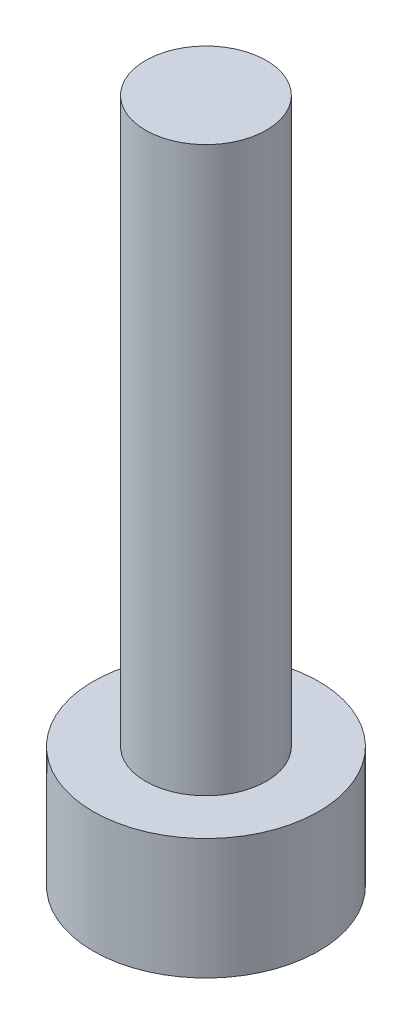
ISO-10303-21;
HEADER;
FILE_DESCRIPTION(('STEP AP214'),'2;1');
FILE_NAME('part.step','',(''),(''),'','','');
FILE_SCHEMA(('AUTOMOTIVE_DESIGN { 1 0 10303 214 1 1 1 1 }'));
ENDSEC;
DATA;
#1=APPLICATION_CONTEXT('core data for automotive mechanical design processes');
#2=APPLICATION_PROTOCOL_DEFINITION('international standard','automotive_design',2000,#1);
#3=PRODUCT_CONTEXT('',#1,'mechanical');
#4=PRODUCT('Part','Part','',(#3));
#5=PRODUCT_RELATED_PRODUCT_CATEGORY('part','',(#4));
#6=PRODUCT_DEFINITION_FORMATION('','',#4);
#7=PRODUCT_DEFINITION_CONTEXT('part definition',#1,'design');
#8=PRODUCT_DEFINITION('design','',#6,#7);
#9=PRODUCT_DEFINITION_SHAPE('','',#8);
#10=(LENGTH_UNIT() NAMED_UNIT(*) SI_UNIT(.MILLI.,.METRE.));
#11=(NAMED_UNIT(*) PLANE_ANGLE_UNIT() SI_UNIT($,.RADIAN.));
#12=(NAMED_UNIT(*) SI_UNIT($,.STERADIAN.) SOLID_ANGLE_UNIT());
#13=UNCERTAINTY_MEASURE_WITH_UNIT(LENGTH_MEASURE(1.E-05),#10,'distance_accuracy_value','');
#14=(GEOMETRIC_REPRESENTATION_CONTEXT(3) GLOBAL_UNCERTAINTY_ASSIGNED_CONTEXT((#13)) GLOBAL_UNIT_ASSIGNED_CONTEXT((#10,
#11,#12)) REPRESENTATION_CONTEXT('',''));
#15=CARTESIAN_POINT('',(0.,0.,0.));
#16=DIRECTION('',(0.,0.,1.));
#17=DIRECTION('',(1.,0.,0.));
#18=AXIS2_PLACEMENT_3D('',#15,#16,#17);
#19=CARTESIAN_POINT('',(0.,3.,0.));
#20=DIRECTION('',(0.,-1.,0.));
#21=DIRECTION('',(0.,0.,-1.));
#22=AXIS2_PLACEMENT_3D('',#19,#20,#21);
#23=CYLINDRICAL_SURFACE('',#22,2.8);
#24=CARTESIAN_POINT('',(0.,3.,0.));
#25=DIRECTION('',(0.,1.,0.));
#26=DIRECTION('',(0.,0.,1.));
#27=AXIS2_PLACEMENT_3D('',#24,#25,#26);
#28=CIRCLE('',#27,2.8);
#29=CARTESIAN_POINT('',(0.,3.,2.8));
#30=VERTEX_POINT('',#29);
#31=EDGE_CURVE('E47',#30,#30,#28,.T.);
#32=ORIENTED_EDGE('',*,*,#31,.F.);
#33=EDGE_LOOP('',(#32));
#34=FACE_BOUND('',#33,.T.);
#35=CARTESIAN_POINT('',(0.,0.,0.));
#36=DIRECTION('',(0.,1.,0.));
#37=DIRECTION('',(0.,0.,1.));
#38=AXIS2_PLACEMENT_3D('',#35,#36,#37);
#39=CIRCLE('',#38,2.8);
#40=CARTESIAN_POINT('',(0.,0.,2.8));
#41=VERTEX_POINT('',#40);
#42=EDGE_CURVE('E42',#41,#41,#39,.T.);
#43=ORIENTED_EDGE('',*,*,#42,.T.);
#44=EDGE_LOOP('',(#43));
#45=FACE_BOUND('',#44,.T.);
#46=ADVANCED_FACE('F39',(#34,#45),#23,.T.);
#47=CARTESIAN_POINT('',(0.,3.,0.));
#48=DIRECTION('',(0.,1.,0.));
#49=DIRECTION('',(0.,0.,1.));
#50=AXIS2_PLACEMENT_3D('',#47,#48,#49);
#51=PLANE('',#50);
#52=CARTESIAN_POINT('',(0.,3.,0.));
#53=DIRECTION('',(0.,1.,0.));
#54=DIRECTION('',(0.,0.,1.));
#55=AXIS2_PLACEMENT_3D('',#52,#53,#54);
#56=CIRCLE('',#55,1.5);
#57=CARTESIAN_POINT('',(0.,3.,1.5));
#58=VERTEX_POINT('',#57);
#59=EDGE_CURVE('E10',#58,#58,#56,.T.);
#60=ORIENTED_EDGE('',*,*,#59,.F.);
#61=EDGE_LOOP('',(#60));
#62=FACE_BOUND('',#61,.T.);
#63=ORIENTED_EDGE('',*,*,#31,.T.);
#64=EDGE_LOOP('',(#63));
#65=FACE_BOUND('',#64,.T.);
#66=ADVANCED_FACE('F67',(#62,#65),#51,.T.);
#67=CARTESIAN_POINT('',(0.,0.,0.));
#68=DIRECTION('',(0.,1.,0.));
#69=DIRECTION('',(0.,0.,1.));
#70=AXIS2_PLACEMENT_3D('',#67,#68,#69);
#71=PLANE('',#70);
#72=ORIENTED_EDGE('',*,*,#42,.F.);
#73=EDGE_LOOP('',(#72));
#74=FACE_BOUND('',#73,.T.);
#75=ADVANCED_FACE('F64',(#74),#71,.F.);
#76=CARTESIAN_POINT('',(0.,17.,0.));
#77=DIRECTION('',(0.,-1.,0.));
#78=DIRECTION('',(0.,0.,-1.));
#79=AXIS2_PLACEMENT_3D('',#76,#77,#78);
#80=CYLINDRICAL_SURFACE('',#79,1.5);
#81=CARTESIAN_POINT('',(0.,17.,0.));
#82=DIRECTION('',(0.,1.,0.));
#83=DIRECTION('',(0.,0.,1.));
#84=AXIS2_PLACEMENT_3D('',#81,#82,#83);
#85=CIRCLE('',#84,1.5);
#86=CARTESIAN_POINT('',(0.,17.,1.5));
#87=VERTEX_POINT('',#86);
#88=EDGE_CURVE('E54',#87,#87,#85,.T.);
#89=ORIENTED_EDGE('',*,*,#88,.F.);
#90=EDGE_LOOP('',(#89));
#91=FACE_BOUND('',#90,.T.);
#92=ORIENTED_EDGE('',*,*,#59,.T.);
#93=EDGE_LOOP('',(#92));
#94=FACE_BOUND('',#93,.T.);
#95=ADVANCED_FACE('F66',(#91,#94),#80,.T.);
#96=CARTESIAN_POINT('',(0.,17.,0.));
#97=DIRECTION('',(0.,1.,0.));
#98=DIRECTION('',(0.,0.,1.));
#99=AXIS2_PLACEMENT_3D('',#96,#97,#98);
#100=PLANE('',#99);
#101=ORIENTED_EDGE('',*,*,#88,.T.);
#102=EDGE_LOOP('',(#101));
#103=FACE_BOUND('',#102,.T.);
#104=ADVANCED_FACE('F72',(#103),#100,.T.);
#105=CLOSED_SHELL('',(#46,#66,#75,#95,#104));
#106=MANIFOLD_SOLID_BREP('B2',#105);
#107=ADVANCED_BREP_SHAPE_REPRESENTATION('',(#18,#106),#14);
#108=SHAPE_DEFINITION_REPRESENTATION(#9,#107);
ENDSEC;
END-ISO-10303-21;
